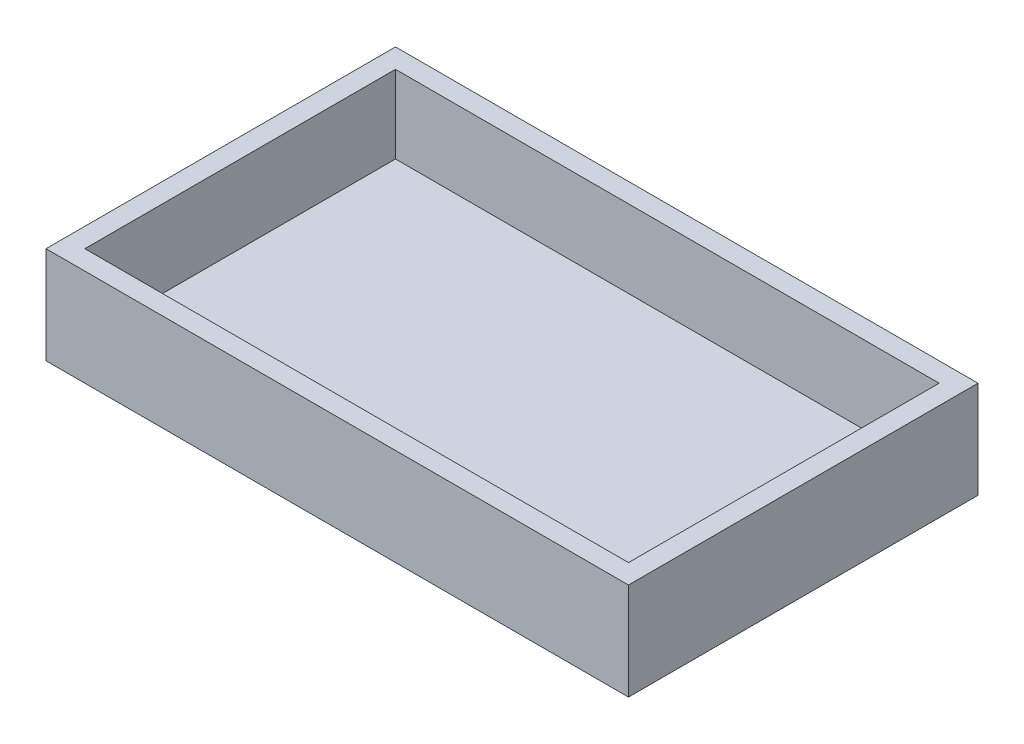
ISO-10303-21;
HEADER;
FILE_DESCRIPTION(('STEP AP214'),'2;1');
FILE_NAME('part.step','',(''),(''),'','','');
FILE_SCHEMA(('AUTOMOTIVE_DESIGN { 1 0 10303 214 1 1 1 1 }'));
ENDSEC;
DATA;
#1=APPLICATION_CONTEXT('core data for automotive mechanical design processes');
#2=APPLICATION_PROTOCOL_DEFINITION('international standard','automotive_design',2000,#1);
#3=PRODUCT_CONTEXT('',#1,'mechanical');
#4=PRODUCT('Part','Part','',(#3));
#5=PRODUCT_RELATED_PRODUCT_CATEGORY('part','',(#4));
#6=PRODUCT_DEFINITION_FORMATION('','',#4);
#7=PRODUCT_DEFINITION_CONTEXT('part definition',#1,'design');
#8=PRODUCT_DEFINITION('design','',#6,#7);
#9=PRODUCT_DEFINITION_SHAPE('','',#8);
#10=(LENGTH_UNIT() NAMED_UNIT(*) SI_UNIT(.MILLI.,.METRE.));
#11=(NAMED_UNIT(*) PLANE_ANGLE_UNIT() SI_UNIT($,.RADIAN.));
#12=(NAMED_UNIT(*) SI_UNIT($,.STERADIAN.) SOLID_ANGLE_UNIT());
#13=UNCERTAINTY_MEASURE_WITH_UNIT(LENGTH_MEASURE(1.E-05),#10,'distance_accuracy_value','');
#14=(GEOMETRIC_REPRESENTATION_CONTEXT(3) GLOBAL_UNCERTAINTY_ASSIGNED_CONTEXT((#13)) GLOBAL_UNIT_ASSIGNED_CONTEXT((#10,
#11,#12)) REPRESENTATION_CONTEXT('',''));
#15=CARTESIAN_POINT('',(0.,0.,0.));
#16=DIRECTION('',(0.,0.,1.));
#17=DIRECTION('',(1.,0.,0.));
#18=AXIS2_PLACEMENT_3D('',#15,#16,#17);
#19=CARTESIAN_POINT('',(-150.,50.,90.));
#20=DIRECTION('',(1.,0.,0.));
#21=DIRECTION('',(0.,0.,-1.));
#22=AXIS2_PLACEMENT_3D('',#19,#20,#21);
#23=PLANE('',#22);
#24=DIRECTION('',(0.,0.,1.));
#25=VECTOR('',#24,1.);
#26=CARTESIAN_POINT('',(-150.,0.,90.));
#27=LINE('',#26,#25);
#28=CARTESIAN_POINT('',(-150.,0.,-90.));
#29=VERTEX_POINT('',#28);
#30=CARTESIAN_POINT('',(-150.,0.,90.));
#31=VERTEX_POINT('',#30);
#32=EDGE_CURVE('E141',#29,#31,#27,.T.);
#33=ORIENTED_EDGE('',*,*,#32,.T.);
#34=DIRECTION('',(0.,-1.,0.));
#35=VECTOR('',#34,1.);
#36=CARTESIAN_POINT('',(-150.,50.,90.));
#37=LINE('',#36,#35);
#38=CARTESIAN_POINT('',(-150.,50.,90.));
#39=VERTEX_POINT('',#38);
#40=EDGE_CURVE('E11',#39,#31,#37,.T.);
#41=ORIENTED_EDGE('',*,*,#40,.F.);
#42=DIRECTION('',(0.,0.,1.));
#43=VECTOR('',#42,1.);
#44=CARTESIAN_POINT('',(-150.,50.,90.));
#45=LINE('',#44,#43);
#46=CARTESIAN_POINT('',(-150.,50.,-90.));
#47=VERTEX_POINT('',#46);
#48=EDGE_CURVE('E145',#47,#39,#45,.T.);
#49=ORIENTED_EDGE('',*,*,#48,.F.);
#50=DIRECTION('',(0.,-1.,0.));
#51=VECTOR('',#50,1.);
#52=CARTESIAN_POINT('',(-150.,50.,-90.));
#53=LINE('',#52,#51);
#54=EDGE_CURVE('E151',#47,#29,#53,.T.);
#55=ORIENTED_EDGE('',*,*,#54,.T.);
#56=EDGE_LOOP('',(#33,#41,#49,#55));
#57=FACE_BOUND('',#56,.T.);
#58=ADVANCED_FACE('F33',(#57),#23,.F.);
#59=CARTESIAN_POINT('',(150.,50.,90.));
#60=DIRECTION('',(0.,0.,-1.));
#61=DIRECTION('',(-1.,0.,0.));
#62=AXIS2_PLACEMENT_3D('',#59,#60,#61);
#63=PLANE('',#62);
#64=DIRECTION('',(1.,0.,0.));
#65=VECTOR('',#64,1.);
#66=CARTESIAN_POINT('',(150.,0.,90.));
#67=LINE('',#66,#65);
#68=CARTESIAN_POINT('',(150.,0.,90.));
#69=VERTEX_POINT('',#68);
#70=EDGE_CURVE('E154',#31,#69,#67,.T.);
#71=ORIENTED_EDGE('',*,*,#70,.T.);
#72=DIRECTION('',(0.,-1.,0.));
#73=VECTOR('',#72,1.);
#74=CARTESIAN_POINT('',(150.,50.,90.));
#75=LINE('',#74,#73);
#76=CARTESIAN_POINT('',(150.,50.,90.));
#77=VERTEX_POINT('',#76);
#78=EDGE_CURVE('E40',#77,#69,#75,.T.);
#79=ORIENTED_EDGE('',*,*,#78,.F.);
#80=DIRECTION('',(1.,0.,0.));
#81=VECTOR('',#80,1.);
#82=CARTESIAN_POINT('',(150.,50.,90.));
#83=LINE('',#82,#81);
#84=EDGE_CURVE('E84',#39,#77,#83,.T.);
#85=ORIENTED_EDGE('',*,*,#84,.F.);
#86=ORIENTED_EDGE('',*,*,#40,.T.);
#87=EDGE_LOOP('',(#71,#79,#85,#86));
#88=FACE_BOUND('',#87,.T.);
#89=ADVANCED_FACE('F183',(#88),#63,.F.);
#90=CARTESIAN_POINT('',(150.,50.,90.));
#91=DIRECTION('',(-1.,0.,0.));
#92=DIRECTION('',(0.,0.,1.));
#93=AXIS2_PLACEMENT_3D('',#90,#91,#92);
#94=PLANE('',#93);
#95=DIRECTION('',(0.,0.,-1.));
#96=VECTOR('',#95,1.);
#97=CARTESIAN_POINT('',(150.,0.,90.));
#98=LINE('',#97,#96);
#99=CARTESIAN_POINT('',(150.,0.,-90.));
#100=VERTEX_POINT('',#99);
#101=EDGE_CURVE('E156',#69,#100,#98,.T.);
#102=ORIENTED_EDGE('',*,*,#101,.T.);
#103=DIRECTION('',(0.,-1.,0.));
#104=VECTOR('',#103,1.);
#105=CARTESIAN_POINT('',(150.,50.,-90.));
#106=LINE('',#105,#104);
#107=CARTESIAN_POINT('',(150.,50.,-90.));
#108=VERTEX_POINT('',#107);
#109=EDGE_CURVE('E160',#108,#100,#106,.T.);
#110=ORIENTED_EDGE('',*,*,#109,.F.);
#111=DIRECTION('',(0.,0.,-1.));
#112=VECTOR('',#111,1.);
#113=CARTESIAN_POINT('',(150.,50.,90.));
#114=LINE('',#113,#112);
#115=EDGE_CURVE('E148',#77,#108,#114,.T.);
#116=ORIENTED_EDGE('',*,*,#115,.F.);
#117=ORIENTED_EDGE('',*,*,#78,.T.);
#118=EDGE_LOOP('',(#102,#110,#116,#117));
#119=FACE_BOUND('',#118,.T.);
#120=ADVANCED_FACE('F165',(#119),#94,.F.);
#121=CARTESIAN_POINT('',(150.,50.,-90.));
#122=DIRECTION('',(0.,0.,1.));
#123=DIRECTION('',(1.,0.,0.));
#124=AXIS2_PLACEMENT_3D('',#121,#122,#123);
#125=PLANE('',#124);
#126=DIRECTION('',(-1.,0.,0.));
#127=VECTOR('',#126,1.);
#128=CARTESIAN_POINT('',(150.,0.,-90.));
#129=LINE('',#128,#127);
#130=EDGE_CURVE('E77',#100,#29,#129,.T.);
#131=ORIENTED_EDGE('',*,*,#130,.T.);
#132=ORIENTED_EDGE('',*,*,#54,.F.);
#133=DIRECTION('',(-1.,0.,0.));
#134=VECTOR('',#133,1.);
#135=CARTESIAN_POINT('',(150.,50.,-90.));
#136=LINE('',#135,#134);
#137=EDGE_CURVE('E56',#108,#47,#136,.T.);
#138=ORIENTED_EDGE('',*,*,#137,.F.);
#139=ORIENTED_EDGE('',*,*,#109,.T.);
#140=EDGE_LOOP('',(#131,#132,#138,#139));
#141=FACE_BOUND('',#140,.T.);
#142=ADVANCED_FACE('F173',(#141),#125,.F.);
#143=CARTESIAN_POINT('',(0.,50.,0.));
#144=DIRECTION('',(0.,1.,0.));
#145=DIRECTION('',(0.,0.,1.));
#146=AXIS2_PLACEMENT_3D('',#143,#144,#145);
#147=PLANE('',#146);
#148=DIRECTION('',(0.,0.,1.));
#149=VECTOR('',#148,1.);
#150=CARTESIAN_POINT('',(-140.,50.,-80.));
#151=LINE('',#150,#149);
#152=CARTESIAN_POINT('',(-140.,50.,-80.));
#153=VERTEX_POINT('',#152);
#154=CARTESIAN_POINT('',(-140.,50.,80.));
#155=VERTEX_POINT('',#154);
#156=EDGE_CURVE('E47',#153,#155,#151,.T.);
#157=ORIENTED_EDGE('',*,*,#156,.F.);
#158=DIRECTION('',(-1.,0.,0.));
#159=VECTOR('',#158,1.);
#160=CARTESIAN_POINT('',(-140.,50.,-80.));
#161=LINE('',#160,#159);
#162=CARTESIAN_POINT('',(140.,50.,-80.));
#163=VERTEX_POINT('',#162);
#164=EDGE_CURVE('E126',#163,#153,#161,.T.);
#165=ORIENTED_EDGE('',*,*,#164,.F.);
#166=DIRECTION('',(0.,0.,-1.));
#167=VECTOR('',#166,1.);
#168=CARTESIAN_POINT('',(140.,50.,-80.));
#169=LINE('',#168,#167);
#170=CARTESIAN_POINT('',(140.,50.,80.));
#171=VERTEX_POINT('',#170);
#172=EDGE_CURVE('E129',#171,#163,#169,.T.);
#173=ORIENTED_EDGE('',*,*,#172,.F.);
#174=DIRECTION('',(1.,0.,0.));
#175=VECTOR('',#174,1.);
#176=CARTESIAN_POINT('',(-140.,50.,80.));
#177=LINE('',#176,#175);
#178=EDGE_CURVE('E135',#155,#171,#177,.T.);
#179=ORIENTED_EDGE('',*,*,#178,.F.);
#180=EDGE_LOOP('',(#157,#165,#173,#179));
#181=FACE_BOUND('',#180,.T.);
#182=ORIENTED_EDGE('',*,*,#48,.T.);
#183=ORIENTED_EDGE('',*,*,#84,.T.);
#184=ORIENTED_EDGE('',*,*,#115,.T.);
#185=ORIENTED_EDGE('',*,*,#137,.T.);
#186=EDGE_LOOP('',(#182,#183,#184,#185));
#187=FACE_BOUND('',#186,.T.);
#188=ADVANCED_FACE('F175',(#181,#187),#147,.T.);
#189=CARTESIAN_POINT('',(0.,0.,0.));
#190=DIRECTION('',(0.,1.,0.));
#191=DIRECTION('',(0.,0.,1.));
#192=AXIS2_PLACEMENT_3D('',#189,#190,#191);
#193=PLANE('',#192);
#194=ORIENTED_EDGE('',*,*,#32,.F.);
#195=ORIENTED_EDGE('',*,*,#130,.F.);
#196=ORIENTED_EDGE('',*,*,#101,.F.);
#197=ORIENTED_EDGE('',*,*,#70,.F.);
#198=EDGE_LOOP('',(#194,#195,#196,#197));
#199=FACE_BOUND('',#198,.T.);
#200=ADVANCED_FACE('F169',(#199),#193,.F.);
#201=CARTESIAN_POINT('',(-140.,10.,-80.));
#202=DIRECTION('',(-1.,0.,0.));
#203=DIRECTION('',(0.,0.,1.));
#204=AXIS2_PLACEMENT_3D('',#201,#202,#203);
#205=PLANE('',#204);
#206=ORIENTED_EDGE('',*,*,#156,.T.);
#207=DIRECTION('',(0.,1.,0.));
#208=VECTOR('',#207,1.);
#209=CARTESIAN_POINT('',(-140.,10.,80.));
#210=LINE('',#209,#208);
#211=CARTESIAN_POINT('',(-140.,10.,80.));
#212=VERTEX_POINT('',#211);
#213=EDGE_CURVE('E104',#212,#155,#210,.T.);
#214=ORIENTED_EDGE('',*,*,#213,.F.);
#215=DIRECTION('',(0.,0.,1.));
#216=VECTOR('',#215,1.);
#217=CARTESIAN_POINT('',(-140.,10.,-80.));
#218=LINE('',#217,#216);
#219=CARTESIAN_POINT('',(-140.,10.,-80.));
#220=VERTEX_POINT('',#219);
#221=EDGE_CURVE('E108',#220,#212,#218,.T.);
#222=ORIENTED_EDGE('',*,*,#221,.F.);
#223=DIRECTION('',(0.,1.,0.));
#224=VECTOR('',#223,1.);
#225=CARTESIAN_POINT('',(-140.,10.,-80.));
#226=LINE('',#225,#224);
#227=EDGE_CURVE('E139',#220,#153,#226,.T.);
#228=ORIENTED_EDGE('',*,*,#227,.T.);
#229=EDGE_LOOP('',(#206,#214,#222,#228));
#230=FACE_BOUND('',#229,.T.);
#231=ADVANCED_FACE('F106',(#230),#205,.F.);
#232=CARTESIAN_POINT('',(-140.,10.,-80.));
#233=DIRECTION('',(0.,0.,-1.));
#234=DIRECTION('',(-1.,0.,0.));
#235=AXIS2_PLACEMENT_3D('',#232,#233,#234);
#236=PLANE('',#235);
#237=ORIENTED_EDGE('',*,*,#164,.T.);
#238=ORIENTED_EDGE('',*,*,#227,.F.);
#239=DIRECTION('',(-1.,0.,0.));
#240=VECTOR('',#239,1.);
#241=CARTESIAN_POINT('',(-140.,10.,-80.));
#242=LINE('',#241,#240);
#243=CARTESIAN_POINT('',(140.,10.,-80.));
#244=VERTEX_POINT('',#243);
#245=EDGE_CURVE('E114',#244,#220,#242,.T.);
#246=ORIENTED_EDGE('',*,*,#245,.F.);
#247=DIRECTION('',(0.,1.,0.));
#248=VECTOR('',#247,1.);
#249=CARTESIAN_POINT('',(140.,10.,-80.));
#250=LINE('',#249,#248);
#251=EDGE_CURVE('E142',#244,#163,#250,.T.);
#252=ORIENTED_EDGE('',*,*,#251,.T.);
#253=EDGE_LOOP('',(#237,#238,#246,#252));
#254=FACE_BOUND('',#253,.T.);
#255=ADVANCED_FACE('F222',(#254),#236,.F.);
#256=CARTESIAN_POINT('',(140.,10.,-80.));
#257=DIRECTION('',(1.,0.,0.));
#258=DIRECTION('',(0.,0.,-1.));
#259=AXIS2_PLACEMENT_3D('',#256,#257,#258);
#260=PLANE('',#259);
#261=ORIENTED_EDGE('',*,*,#172,.T.);
#262=ORIENTED_EDGE('',*,*,#251,.F.);
#263=DIRECTION('',(0.,0.,-1.));
#264=VECTOR('',#263,1.);
#265=CARTESIAN_POINT('',(140.,10.,-80.));
#266=LINE('',#265,#264);
#267=CARTESIAN_POINT('',(140.,10.,80.));
#268=VERTEX_POINT('',#267);
#269=EDGE_CURVE('E122',#268,#244,#266,.T.);
#270=ORIENTED_EDGE('',*,*,#269,.F.);
#271=DIRECTION('',(0.,1.,0.));
#272=VECTOR('',#271,1.);
#273=CARTESIAN_POINT('',(140.,10.,80.));
#274=LINE('',#273,#272);
#275=EDGE_CURVE('E113',#268,#171,#274,.T.);
#276=ORIENTED_EDGE('',*,*,#275,.T.);
#277=EDGE_LOOP('',(#261,#262,#270,#276));
#278=FACE_BOUND('',#277,.T.);
#279=ADVANCED_FACE('F231',(#278),#260,.F.);
#280=CARTESIAN_POINT('',(-140.,10.,80.));
#281=DIRECTION('',(0.,0.,1.));
#282=DIRECTION('',(1.,0.,0.));
#283=AXIS2_PLACEMENT_3D('',#280,#281,#282);
#284=PLANE('',#283);
#285=ORIENTED_EDGE('',*,*,#178,.T.);
#286=ORIENTED_EDGE('',*,*,#275,.F.);
#287=DIRECTION('',(1.,0.,0.));
#288=VECTOR('',#287,1.);
#289=CARTESIAN_POINT('',(-140.,10.,80.));
#290=LINE('',#289,#288);
#291=EDGE_CURVE('E117',#212,#268,#290,.T.);
#292=ORIENTED_EDGE('',*,*,#291,.F.);
#293=ORIENTED_EDGE('',*,*,#213,.T.);
#294=EDGE_LOOP('',(#285,#286,#292,#293));
#295=FACE_BOUND('',#294,.T.);
#296=ADVANCED_FACE('F118',(#295),#284,.F.);
#297=CARTESIAN_POINT('',(0.,10.,0.));
#298=DIRECTION('',(0.,1.,0.));
#299=DIRECTION('',(0.,0.,1.));
#300=AXIS2_PLACEMENT_3D('',#297,#298,#299);
#301=PLANE('',#300);
#302=ORIENTED_EDGE('',*,*,#221,.T.);
#303=ORIENTED_EDGE('',*,*,#291,.T.);
#304=ORIENTED_EDGE('',*,*,#269,.T.);
#305=ORIENTED_EDGE('',*,*,#245,.T.);
#306=EDGE_LOOP('',(#302,#303,#304,#305));
#307=FACE_BOUND('',#306,.T.);
#308=ADVANCED_FACE('F124',(#307),#301,.T.);
#309=CLOSED_SHELL('',(#58,#89,#120,#142,#188,#200,#231,#255,#279,#296,#308));
#310=MANIFOLD_SOLID_BREP('B2',#309);
#311=ADVANCED_BREP_SHAPE_REPRESENTATION('',(#18,#310),#14);
#312=SHAPE_DEFINITION_REPRESENTATION(#9,#311);
ENDSEC;
END-ISO-10303-21;
